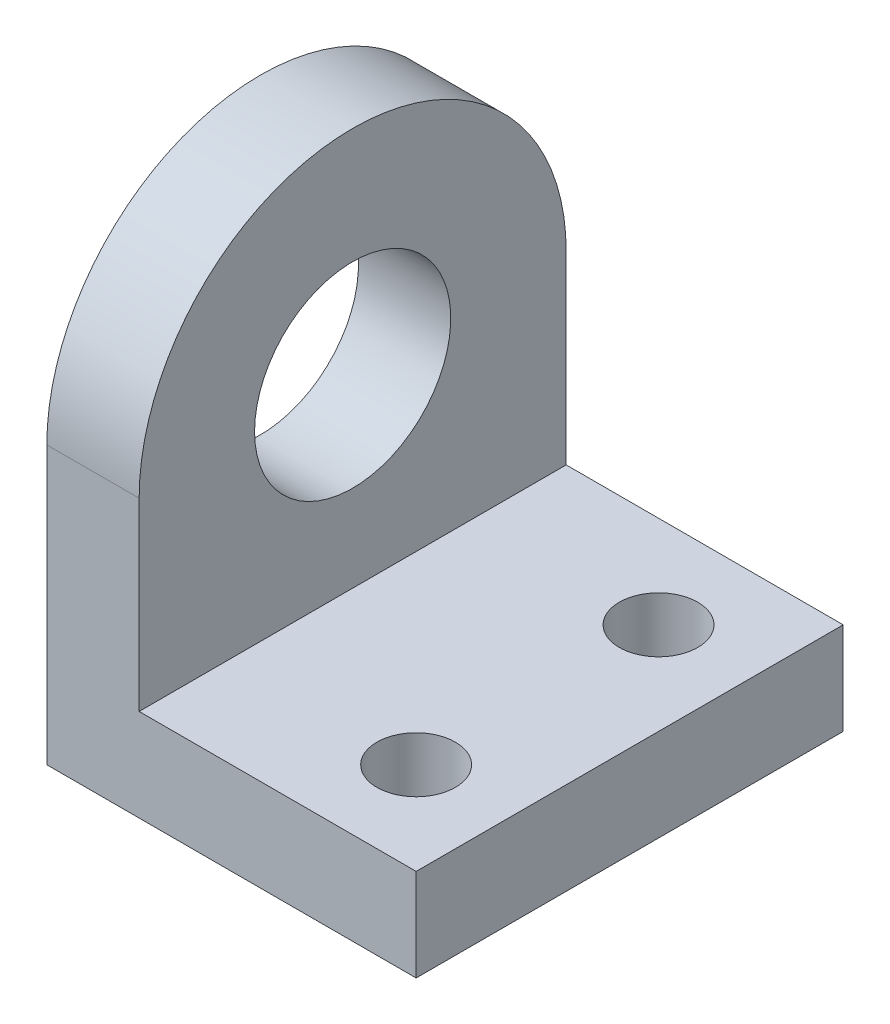
ISO-10303-21;
HEADER;
FILE_DESCRIPTION(('STEP AP214'),'2;1');
FILE_NAME('part.step','',(''),(''),'','','');
FILE_SCHEMA(('AUTOMOTIVE_DESIGN { 1 0 10303 214 1 1 1 1 }'));
ENDSEC;
DATA;
#1=APPLICATION_CONTEXT('core data for automotive mechanical design processes');
#2=APPLICATION_PROTOCOL_DEFINITION('international standard','automotive_design',2000,#1);
#3=PRODUCT_CONTEXT('',#1,'mechanical');
#4=PRODUCT('Part','Part','',(#3));
#5=PRODUCT_RELATED_PRODUCT_CATEGORY('part','',(#4));
#6=PRODUCT_DEFINITION_FORMATION('','',#4);
#7=PRODUCT_DEFINITION_CONTEXT('part definition',#1,'design');
#8=PRODUCT_DEFINITION('design','',#6,#7);
#9=PRODUCT_DEFINITION_SHAPE('','',#8);
#10=(LENGTH_UNIT() NAMED_UNIT(*) SI_UNIT(.MILLI.,.METRE.));
#11=(NAMED_UNIT(*) PLANE_ANGLE_UNIT() SI_UNIT($,.RADIAN.));
#12=(NAMED_UNIT(*) SI_UNIT($,.STERADIAN.) SOLID_ANGLE_UNIT());
#13=UNCERTAINTY_MEASURE_WITH_UNIT(LENGTH_MEASURE(1.E-05),#10,'distance_accuracy_value','');
#14=(GEOMETRIC_REPRESENTATION_CONTEXT(3) GLOBAL_UNCERTAINTY_ASSIGNED_CONTEXT((#13)) GLOBAL_UNIT_ASSIGNED_CONTEXT((#10,
#11,#12)) REPRESENTATION_CONTEXT('',''));
#15=CARTESIAN_POINT('',(0.,0.,0.));
#16=DIRECTION('',(0.,0.,1.));
#17=DIRECTION('',(1.,0.,0.));
#18=AXIS2_PLACEMENT_3D('',#15,#16,#17);
#19=CARTESIAN_POINT('',(4.00000000000002,0.,0.));
#20=DIRECTION('',(-1.,0.,0.));
#21=DIRECTION('',(0.,0.,-1.));
#22=AXIS2_PLACEMENT_3D('',#19,#20,#21);
#23=PLANE('',#22);
#24=CARTESIAN_POINT('',(4.00000000000002,0.,0.));
#25=DIRECTION('',(-1.,0.,0.));
#26=DIRECTION('',(0.,0.,1.));
#27=AXIS2_PLACEMENT_3D('',#24,#25,#26);
#28=CIRCLE('',#27,4.25);
#29=CARTESIAN_POINT('',(4.00000000000002,0.,4.25));
#30=VERTEX_POINT('',#29);
#31=EDGE_CURVE('E95',#30,#30,#28,.T.);
#32=ORIENTED_EDGE('',*,*,#31,.T.);
#33=EDGE_LOOP('',(#32));
#34=FACE_BOUND('',#33,.T.);
#35=DIRECTION('',(0.,0.,-1.));
#36=VECTOR('',#35,1.);
#37=CARTESIAN_POINT('',(4.,-8.00000000000001,-9.24999999999998));
#38=LINE('',#37,#36);
#39=CARTESIAN_POINT('',(4.,-8.00000000000009,9.25000000000009));
#40=VERTEX_POINT('',#39);
#41=CARTESIAN_POINT('',(4.,-8.00000000000001,-9.24999999999998));
#42=VERTEX_POINT('',#41);
#43=EDGE_CURVE('E121',#40,#42,#38,.T.);
#44=ORIENTED_EDGE('',*,*,#43,.T.);
#45=DIRECTION('',(0.,-1.,0.));
#46=VECTOR('',#45,1.);
#47=CARTESIAN_POINT('',(3.99999999999999,0.,-9.24999999999998));
#48=LINE('',#47,#46);
#49=CARTESIAN_POINT('',(3.99999999999999,0.,-9.24999999999998));
#50=VERTEX_POINT('',#49);
#51=EDGE_CURVE('E108',#50,#42,#48,.T.);
#52=ORIENTED_EDGE('',*,*,#51,.F.);
#53=CARTESIAN_POINT('',(4.00000000000002,0.,0.));
#54=DIRECTION('',(-1.,0.,0.));
#55=DIRECTION('',(0.,0.,-1.));
#56=AXIS2_PLACEMENT_3D('',#53,#54,#55);
#57=CIRCLE('',#56,9.25);
#58=CARTESIAN_POINT('',(4.00000000000002,0.,9.25000000000004));
#59=VERTEX_POINT('',#58);
#60=EDGE_CURVE('E91',#59,#50,#57,.T.);
#61=ORIENTED_EDGE('',*,*,#60,.F.);
#62=DIRECTION('',(0.,1.,0.));
#63=VECTOR('',#62,1.);
#64=CARTESIAN_POINT('',(4.00000000000002,0.,9.25000000000004));
#65=LINE('',#64,#63);
#66=EDGE_CURVE('E79',#40,#59,#65,.T.);
#67=ORIENTED_EDGE('',*,*,#66,.F.);
#68=EDGE_LOOP('',(#44,#52,#61,#67));
#69=FACE_BOUND('',#68,.T.);
#70=ADVANCED_FACE('F33',(#34,#69),#23,.F.);
#71=CARTESIAN_POINT('',(0.,0.,0.));
#72=DIRECTION('',(-1.,0.,0.));
#73=DIRECTION('',(0.,0.,-1.));
#74=AXIS2_PLACEMENT_3D('',#71,#72,#73);
#75=PLANE('',#74);
#76=CARTESIAN_POINT('',(0.,0.,0.));
#77=DIRECTION('',(-1.,0.,0.));
#78=DIRECTION('',(0.,0.,-1.));
#79=AXIS2_PLACEMENT_3D('',#76,#77,#78);
#80=CIRCLE('',#79,9.25);
#81=CARTESIAN_POINT('',(0.,0.,9.25000000000004));
#82=VERTEX_POINT('',#81);
#83=CARTESIAN_POINT('',(0.,0.,-9.24999999999998));
#84=VERTEX_POINT('',#83);
#85=EDGE_CURVE('E88',#82,#84,#80,.T.);
#86=ORIENTED_EDGE('',*,*,#85,.T.);
#87=DIRECTION('',(0.,-1.,0.));
#88=VECTOR('',#87,1.);
#89=CARTESIAN_POINT('',(0.,0.,-9.24999999999998));
#90=LINE('',#89,#88);
#91=CARTESIAN_POINT('',(0.,-12.,-9.24999999999993));
#92=VERTEX_POINT('',#91);
#93=EDGE_CURVE('E94',#84,#92,#90,.T.);
#94=ORIENTED_EDGE('',*,*,#93,.T.);
#95=DIRECTION('',(0.,0.,1.));
#96=VECTOR('',#95,1.);
#97=CARTESIAN_POINT('',(0.,-12.,-9.24999999999993));
#98=LINE('',#97,#96);
#99=CARTESIAN_POINT('',(0.,-12.0000000000001,9.25000000000009));
#100=VERTEX_POINT('',#99);
#101=EDGE_CURVE('E90',#92,#100,#98,.T.);
#102=ORIENTED_EDGE('',*,*,#101,.T.);
#103=DIRECTION('',(0.,1.,0.));
#104=VECTOR('',#103,1.);
#105=CARTESIAN_POINT('',(0.,0.,9.25000000000004));
#106=LINE('',#105,#104);
#107=EDGE_CURVE('E77',#100,#82,#106,.T.);
#108=ORIENTED_EDGE('',*,*,#107,.T.);
#109=EDGE_LOOP('',(#86,#94,#102,#108));
#110=FACE_BOUND('',#109,.T.);
#111=CARTESIAN_POINT('',(0.,0.,0.));
#112=DIRECTION('',(-1.,0.,0.));
#113=DIRECTION('',(0.,0.,1.));
#114=AXIS2_PLACEMENT_3D('',#111,#112,#113);
#115=CIRCLE('',#114,4.25);
#116=CARTESIAN_POINT('',(0.,0.,4.25));
#117=VERTEX_POINT('',#116);
#118=EDGE_CURVE('E99',#117,#117,#115,.T.);
#119=ORIENTED_EDGE('',*,*,#118,.F.);
#120=EDGE_LOOP('',(#119));
#121=FACE_BOUND('',#120,.T.);
#122=ADVANCED_FACE('F85',(#110,#121),#75,.T.);
#123=CARTESIAN_POINT('',(4.00000000000002,0.,0.));
#124=DIRECTION('',(-1.,0.,0.));
#125=DIRECTION('',(0.,0.,-1.));
#126=AXIS2_PLACEMENT_3D('',#123,#124,#125);
#127=CYLINDRICAL_SURFACE('',#126,9.25);
#128=ORIENTED_EDGE('',*,*,#85,.F.);
#129=DIRECTION('',(-1.,0.,0.));
#130=VECTOR('',#129,1.);
#131=CARTESIAN_POINT('',(4.00000000000002,0.,9.25000000000004));
#132=LINE('',#131,#130);
#133=EDGE_CURVE('E59',#59,#82,#132,.T.);
#134=ORIENTED_EDGE('',*,*,#133,.F.);
#135=ORIENTED_EDGE('',*,*,#60,.T.);
#136=DIRECTION('',(-1.,0.,0.));
#137=VECTOR('',#136,1.);
#138=CARTESIAN_POINT('',(3.99999999999999,0.,-9.24999999999998));
#139=LINE('',#138,#137);
#140=EDGE_CURVE('E11',#50,#84,#139,.T.);
#141=ORIENTED_EDGE('',*,*,#140,.T.);
#142=EDGE_LOOP('',(#128,#134,#135,#141));
#143=FACE_BOUND('',#142,.T.);
#144=ADVANCED_FACE('F35',(#143),#127,.T.);
#145=CARTESIAN_POINT('',(3.99999999999999,0.,-9.24999999999998));
#146=DIRECTION('',(0.,0.,1.));
#147=DIRECTION('',(0.,1.,0.));
#148=AXIS2_PLACEMENT_3D('',#145,#146,#147);
#149=PLANE('',#148);
#150=ORIENTED_EDGE('',*,*,#93,.F.);
#151=ORIENTED_EDGE('',*,*,#140,.F.);
#152=ORIENTED_EDGE('',*,*,#51,.T.);
#153=DIRECTION('',(-1.,0.,0.));
#154=VECTOR('',#153,1.);
#155=CARTESIAN_POINT('',(16.0000000000001,-7.99999999999995,-9.24999999999998));
#156=LINE('',#155,#154);
#157=CARTESIAN_POINT('',(16.0000000000001,-7.99999999999995,-9.24999999999998));
#158=VERTEX_POINT('',#157);
#159=EDGE_CURVE('E126',#158,#42,#156,.T.);
#160=ORIENTED_EDGE('',*,*,#159,.F.);
#161=DIRECTION('',(0.,-1.,0.));
#162=VECTOR('',#161,1.);
#163=CARTESIAN_POINT('',(16.,-11.9999999999999,-9.24999999999993));
#164=LINE('',#163,#162);
#165=CARTESIAN_POINT('',(16.,-11.9999999999999,-9.24999999999993));
#166=VERTEX_POINT('',#165);
#167=EDGE_CURVE('E124',#158,#166,#164,.T.);
#168=ORIENTED_EDGE('',*,*,#167,.T.);
#169=DIRECTION('',(-1.,0.,0.));
#170=VECTOR('',#169,1.);
#171=CARTESIAN_POINT('',(4.,-12.,-9.24999999999993));
#172=LINE('',#171,#170);
#173=EDGE_CURVE('E42',#166,#92,#172,.T.);
#174=ORIENTED_EDGE('',*,*,#173,.T.);
#175=EDGE_LOOP('',(#150,#151,#152,#160,#168,#174));
#176=FACE_BOUND('',#175,.T.);
#177=ADVANCED_FACE('F188',(#176),#149,.F.);
#178=CARTESIAN_POINT('',(4.,-12.,-9.24999999999993));
#179=DIRECTION('',(0.,1.,0.));
#180=DIRECTION('',(0.,0.,-1.));
#181=AXIS2_PLACEMENT_3D('',#178,#179,#180);
#182=PLANE('',#181);
#183=CARTESIAN_POINT('',(12.,-12.0000000000001,5.25000000000009));
#184=DIRECTION('',(0.,-1.,0.));
#185=DIRECTION('',(0.,0.,-1.));
#186=AXIS2_PLACEMENT_3D('',#183,#184,#185);
#187=CIRCLE('',#186,1.7);
#188=CARTESIAN_POINT('',(12.,-12.0000000000001,3.55000000000009));
#189=VERTEX_POINT('',#188);
#190=EDGE_CURVE('E151',#189,#189,#187,.T.);
#191=ORIENTED_EDGE('',*,*,#190,.F.);
#192=EDGE_LOOP('',(#191));
#193=FACE_BOUND('',#192,.T.);
#194=CARTESIAN_POINT('',(12.,-12.,-5.24999999999992));
#195=DIRECTION('',(0.,-1.,0.));
#196=DIRECTION('',(0.,0.,-1.));
#197=AXIS2_PLACEMENT_3D('',#194,#195,#196);
#198=CIRCLE('',#197,1.7);
#199=CARTESIAN_POINT('',(12.,-12.,-6.94999999999992));
#200=VERTEX_POINT('',#199);
#201=EDGE_CURVE('E125',#200,#200,#198,.T.);
#202=ORIENTED_EDGE('',*,*,#201,.F.);
#203=EDGE_LOOP('',(#202));
#204=FACE_BOUND('',#203,.T.);
#205=ORIENTED_EDGE('',*,*,#101,.F.);
#206=ORIENTED_EDGE('',*,*,#173,.F.);
#207=DIRECTION('',(0.,0.,1.));
#208=VECTOR('',#207,1.);
#209=CARTESIAN_POINT('',(16.,-11.9999999999999,-9.24999999999993));
#210=LINE('',#209,#208);
#211=CARTESIAN_POINT('',(16.0000000000001,-12.0000000000001,9.25000000000009));
#212=VERTEX_POINT('',#211);
#213=EDGE_CURVE('E138',#166,#212,#210,.T.);
#214=ORIENTED_EDGE('',*,*,#213,.T.);
#215=DIRECTION('',(-1.,0.,0.));
#216=VECTOR('',#215,1.);
#217=CARTESIAN_POINT('',(4.,-12.0000000000001,9.25000000000009));
#218=LINE('',#217,#216);
#219=EDGE_CURVE('E81',#212,#100,#218,.T.);
#220=ORIENTED_EDGE('',*,*,#219,.T.);
#221=EDGE_LOOP('',(#205,#206,#214,#220));
#222=FACE_BOUND('',#221,.T.);
#223=ADVANCED_FACE('F186',(#193,#204,#222),#182,.F.);
#224=CARTESIAN_POINT('',(4.00000000000002,0.,9.25000000000004));
#225=DIRECTION('',(0.,0.,-1.));
#226=DIRECTION('',(0.,-1.,0.));
#227=AXIS2_PLACEMENT_3D('',#224,#225,#226);
#228=PLANE('',#227);
#229=ORIENTED_EDGE('',*,*,#107,.F.);
#230=ORIENTED_EDGE('',*,*,#219,.F.);
#231=DIRECTION('',(0.,1.,0.));
#232=VECTOR('',#231,1.);
#233=CARTESIAN_POINT('',(16.0000000000001,-12.0000000000001,9.25000000000009));
#234=LINE('',#233,#232);
#235=CARTESIAN_POINT('',(16.,-8.00000000000008,9.25000000000009));
#236=VERTEX_POINT('',#235);
#237=EDGE_CURVE('E135',#212,#236,#234,.T.);
#238=ORIENTED_EDGE('',*,*,#237,.T.);
#239=DIRECTION('',(-1.,0.,0.));
#240=VECTOR('',#239,1.);
#241=CARTESIAN_POINT('',(16.,-8.00000000000008,9.25000000000009));
#242=LINE('',#241,#240);
#243=EDGE_CURVE('E50',#236,#40,#242,.T.);
#244=ORIENTED_EDGE('',*,*,#243,.T.);
#245=ORIENTED_EDGE('',*,*,#66,.T.);
#246=ORIENTED_EDGE('',*,*,#133,.T.);
#247=EDGE_LOOP('',(#229,#230,#238,#244,#245,#246));
#248=FACE_BOUND('',#247,.T.);
#249=ADVANCED_FACE('F75',(#248),#228,.F.);
#250=CARTESIAN_POINT('',(4.00000000000002,0.,0.));
#251=DIRECTION('',(-1.,0.,0.));
#252=DIRECTION('',(0.,0.,-1.));
#253=AXIS2_PLACEMENT_3D('',#250,#251,#252);
#254=CYLINDRICAL_SURFACE('',#253,4.25);
#255=ORIENTED_EDGE('',*,*,#31,.F.);
#256=EDGE_LOOP('',(#255));
#257=FACE_BOUND('',#256,.T.);
#258=ORIENTED_EDGE('',*,*,#118,.T.);
#259=EDGE_LOOP('',(#258));
#260=FACE_BOUND('',#259,.T.);
#261=ADVANCED_FACE('F181',(#257,#260),#254,.F.);
#262=CARTESIAN_POINT('',(16.0000000000001,-7.99999999999995,-9.24999999999998));
#263=DIRECTION('',(0.,-1.,0.));
#264=DIRECTION('',(0.,0.,1.));
#265=AXIS2_PLACEMENT_3D('',#262,#263,#264);
#266=PLANE('',#265);
#267=CARTESIAN_POINT('',(12.,-8.00000000000006,5.25000000000009));
#268=DIRECTION('',(0.,-1.,0.));
#269=DIRECTION('',(0.,0.,-1.));
#270=AXIS2_PLACEMENT_3D('',#267,#268,#269);
#271=CIRCLE('',#270,1.7);
#272=CARTESIAN_POINT('',(12.,-8.00000000000005,3.55000000000009));
#273=VERTEX_POINT('',#272);
#274=EDGE_CURVE('E154',#273,#273,#271,.T.);
#275=ORIENTED_EDGE('',*,*,#274,.T.);
#276=EDGE_LOOP('',(#275));
#277=FACE_BOUND('',#276,.T.);
#278=CARTESIAN_POINT('',(12.0000000000001,-7.99999999999996,-5.24999999999998));
#279=DIRECTION('',(0.,-1.,0.));
#280=DIRECTION('',(0.,0.,-1.));
#281=AXIS2_PLACEMENT_3D('',#278,#279,#280);
#282=CIRCLE('',#281,1.7);
#283=CARTESIAN_POINT('',(12.0000000000001,-7.99999999999996,-6.94999999999998));
#284=VERTEX_POINT('',#283);
#285=EDGE_CURVE('E148',#284,#284,#282,.T.);
#286=ORIENTED_EDGE('',*,*,#285,.T.);
#287=EDGE_LOOP('',(#286));
#288=FACE_BOUND('',#287,.T.);
#289=ORIENTED_EDGE('',*,*,#43,.F.);
#290=ORIENTED_EDGE('',*,*,#243,.F.);
#291=DIRECTION('',(0.,0.,-1.));
#292=VECTOR('',#291,1.);
#293=CARTESIAN_POINT('',(16.0000000000001,-7.99999999999995,-9.24999999999998));
#294=LINE('',#293,#292);
#295=EDGE_CURVE('E119',#236,#158,#294,.T.);
#296=ORIENTED_EDGE('',*,*,#295,.T.);
#297=ORIENTED_EDGE('',*,*,#159,.T.);
#298=EDGE_LOOP('',(#289,#290,#296,#297));
#299=FACE_BOUND('',#298,.T.);
#300=ADVANCED_FACE('F158',(#277,#288,#299),#266,.F.);
#301=CARTESIAN_POINT('',(16.0000000000001,0.,0.));
#302=DIRECTION('',(-1.,0.,0.));
#303=DIRECTION('',(0.,0.,-1.));
#304=AXIS2_PLACEMENT_3D('',#301,#302,#303);
#305=PLANE('',#304);
#306=ORIENTED_EDGE('',*,*,#167,.F.);
#307=ORIENTED_EDGE('',*,*,#295,.F.);
#308=ORIENTED_EDGE('',*,*,#237,.F.);
#309=ORIENTED_EDGE('',*,*,#213,.F.);
#310=EDGE_LOOP('',(#306,#307,#308,#309));
#311=FACE_BOUND('',#310,.T.);
#312=ADVANCED_FACE('F169',(#311),#305,.F.);
#313=CARTESIAN_POINT('',(12.0000000000001,-7.99999999999996,-5.24999999999998));
#314=DIRECTION('',(0.,1.,0.));
#315=DIRECTION('',(0.,0.,-1.));
#316=AXIS2_PLACEMENT_3D('',#313,#314,#315);
#317=CYLINDRICAL_SURFACE('',#316,1.7);
#318=ORIENTED_EDGE('',*,*,#201,.T.);
#319=EDGE_LOOP('',(#318));
#320=FACE_BOUND('',#319,.T.);
#321=ORIENTED_EDGE('',*,*,#285,.F.);
#322=EDGE_LOOP('',(#321));
#323=FACE_BOUND('',#322,.T.);
#324=ADVANCED_FACE('F163',(#320,#323),#317,.F.);
#325=CARTESIAN_POINT('',(12.,-8.00000000000006,5.25000000000009));
#326=DIRECTION('',(0.,1.,0.));
#327=DIRECTION('',(0.,0.,-1.));
#328=AXIS2_PLACEMENT_3D('',#325,#326,#327);
#329=CYLINDRICAL_SURFACE('',#328,1.7);
#330=ORIENTED_EDGE('',*,*,#190,.T.);
#331=EDGE_LOOP('',(#330));
#332=FACE_BOUND('',#331,.T.);
#333=ORIENTED_EDGE('',*,*,#274,.F.);
#334=EDGE_LOOP('',(#333));
#335=FACE_BOUND('',#334,.T.);
#336=ADVANCED_FACE('F161',(#332,#335),#329,.F.);
#337=CLOSED_SHELL('',(#70,#122,#144,#177,#223,#249,#261,#300,#312,#324,#336));
#338=MANIFOLD_SOLID_BREP('B2',#337);
#339=ADVANCED_BREP_SHAPE_REPRESENTATION('',(#18,#338),#14);
#340=SHAPE_DEFINITION_REPRESENTATION(#9,#339);
ENDSEC;
END-ISO-10303-21;
